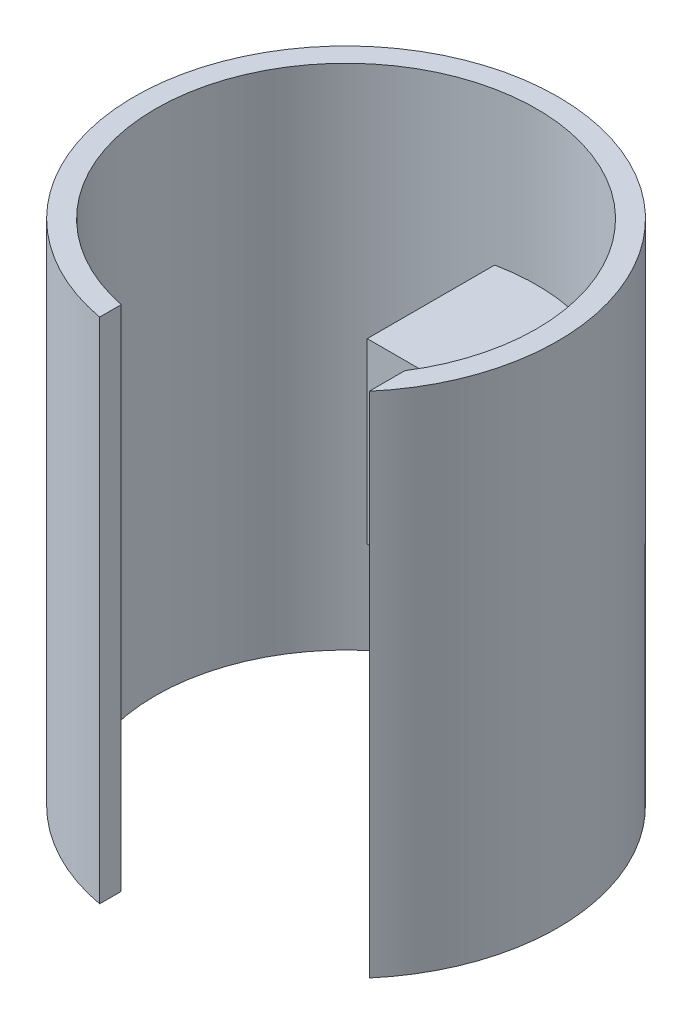
ISO-10303-21;
HEADER;
FILE_DESCRIPTION(('STEP AP214'),'2;1');
FILE_NAME('part.step','',(''),(''),'','','');
FILE_SCHEMA(('AUTOMOTIVE_DESIGN { 1 0 10303 214 1 1 1 1 }'));
ENDSEC;
DATA;
#1=APPLICATION_CONTEXT('core data for automotive mechanical design processes');
#2=APPLICATION_PROTOCOL_DEFINITION('international standard','automotive_design',2000,#1);
#3=PRODUCT_CONTEXT('',#1,'mechanical');
#4=PRODUCT('Part','Part','',(#3));
#5=PRODUCT_RELATED_PRODUCT_CATEGORY('part','',(#4));
#6=PRODUCT_DEFINITION_FORMATION('','',#4);
#7=PRODUCT_DEFINITION_CONTEXT('part definition',#1,'design');
#8=PRODUCT_DEFINITION('design','',#6,#7);
#9=PRODUCT_DEFINITION_SHAPE('','',#8);
#10=(LENGTH_UNIT() NAMED_UNIT(*) SI_UNIT(.MILLI.,.METRE.));
#11=(NAMED_UNIT(*) PLANE_ANGLE_UNIT() SI_UNIT($,.RADIAN.));
#12=(NAMED_UNIT(*) SI_UNIT($,.STERADIAN.) SOLID_ANGLE_UNIT());
#13=UNCERTAINTY_MEASURE_WITH_UNIT(LENGTH_MEASURE(1.E-05),#10,'distance_accuracy_value','');
#14=(GEOMETRIC_REPRESENTATION_CONTEXT(3) GLOBAL_UNCERTAINTY_ASSIGNED_CONTEXT((#13)) GLOBAL_UNIT_ASSIGNED_CONTEXT((#10,
#11,#12)) REPRESENTATION_CONTEXT('',''));
#15=CARTESIAN_POINT('',(0.,0.,0.));
#16=DIRECTION('',(0.,0.,1.));
#17=DIRECTION('',(1.,0.,0.));
#18=AXIS2_PLACEMENT_3D('',#15,#16,#17);
#19=CARTESIAN_POINT('',(0.,120.,0.));
#20=DIRECTION('',(0.,-1.,0.));
#21=DIRECTION('',(0.,0.,-1.));
#22=AXIS2_PLACEMENT_3D('',#19,#20,#21);
#23=CYLINDRICAL_SURFACE('',#22,50.);
#24=CARTESIAN_POINT('',(0.,120.,0.));
#25=DIRECTION('',(0.,1.,0.));
#26=DIRECTION('',(0.,0.,1.));
#27=AXIS2_PLACEMENT_3D('',#24,#25,#26);
#28=CIRCLE('',#27,50.);
#29=CARTESIAN_POINT('',(38.,120.,32.4961536185438));
#30=VERTEX_POINT('',#29);
#31=CARTESIAN_POINT('',(-9.,120.,49.1833305094317));
#32=VERTEX_POINT('',#31);
#33=EDGE_CURVE('E11',#30,#32,#28,.T.);
#34=ORIENTED_EDGE('',*,*,#33,.F.);
#35=DIRECTION('',(0.,1.,0.));
#36=VECTOR('',#35,1.);
#37=CARTESIAN_POINT('',(38.,-0.001000000000001,32.4961536185438));
#38=LINE('',#37,#36);
#39=CARTESIAN_POINT('',(38.,0.,32.4961536185438));
#40=VERTEX_POINT('',#39);
#41=EDGE_CURVE('E150',#40,#30,#38,.T.);
#42=ORIENTED_EDGE('',*,*,#41,.F.);
#43=CARTESIAN_POINT('',(0.,0.,0.));
#44=DIRECTION('',(0.,1.,0.));
#45=DIRECTION('',(0.,0.,1.));
#46=AXIS2_PLACEMENT_3D('',#43,#44,#45);
#47=CIRCLE('',#46,50.);
#48=CARTESIAN_POINT('',(-9.,0.,49.1833305094317));
#49=VERTEX_POINT('',#48);
#50=EDGE_CURVE('E36',#40,#49,#47,.T.);
#51=ORIENTED_EDGE('',*,*,#50,.T.);
#52=DIRECTION('',(0.,1.,0.));
#53=VECTOR('',#52,1.);
#54=CARTESIAN_POINT('',(-9.,-0.001000000000001,49.1833305094317));
#55=LINE('',#54,#53);
#56=EDGE_CURVE('E103',#49,#32,#55,.T.);
#57=ORIENTED_EDGE('',*,*,#56,.T.);
#58=EDGE_LOOP('',(#34,#42,#51,#57));
#59=FACE_BOUND('',#58,.T.);
#60=ADVANCED_FACE('F33',(#59),#23,.T.);
#61=CARTESIAN_POINT('',(0.,120.,0.));
#62=DIRECTION('',(0.,1.,0.));
#63=DIRECTION('',(0.,0.,1.));
#64=AXIS2_PLACEMENT_3D('',#61,#62,#63);
#65=PLANE('',#64);
#66=DIRECTION('',(0.,0.,-1.));
#67=VECTOR('',#66,1.);
#68=CARTESIAN_POINT('',(38.,120.,24.1039415863879));
#69=LINE('',#68,#67);
#70=CARTESIAN_POINT('',(38.,120.,24.1039415863879));
#71=VERTEX_POINT('',#70);
#72=EDGE_CURVE('E55',#30,#71,#69,.T.);
#73=ORIENTED_EDGE('',*,*,#72,.F.);
#74=ORIENTED_EDGE('',*,*,#33,.T.);
#75=DIRECTION('',(0.,0.,1.));
#76=VECTOR('',#75,1.);
#77=CARTESIAN_POINT('',(-9.,120.,44.0908153700972));
#78=LINE('',#77,#76);
#79=CARTESIAN_POINT('',(-9.,120.,44.0908153700972));
#80=VERTEX_POINT('',#79);
#81=EDGE_CURVE('E97',#80,#32,#78,.T.);
#82=ORIENTED_EDGE('',*,*,#81,.F.);
#83=CARTESIAN_POINT('',(0.,120.,0.));
#84=DIRECTION('',(0.,1.,0.));
#85=DIRECTION('',(0.,0.,1.));
#86=AXIS2_PLACEMENT_3D('',#83,#84,#85);
#87=CIRCLE('',#86,45.);
#88=EDGE_CURVE('E108',#71,#80,#87,.T.);
#89=ORIENTED_EDGE('',*,*,#88,.F.);
#90=EDGE_LOOP('',(#73,#74,#82,#89));
#91=FACE_BOUND('',#90,.T.);
#92=ADVANCED_FACE('F107',(#91),#65,.T.);
#93=CARTESIAN_POINT('',(0.,0.,0.));
#94=DIRECTION('',(0.,1.,0.));
#95=DIRECTION('',(0.,0.,1.));
#96=AXIS2_PLACEMENT_3D('',#93,#94,#95);
#97=PLANE('',#96);
#98=ORIENTED_EDGE('',*,*,#50,.F.);
#99=DIRECTION('',(0.,0.,1.));
#100=VECTOR('',#99,1.);
#101=CARTESIAN_POINT('',(38.,0.,24.1039415863879));
#102=LINE('',#101,#100);
#103=CARTESIAN_POINT('',(38.,0.,24.1039415863879));
#104=VERTEX_POINT('',#103);
#105=EDGE_CURVE('E110',#104,#40,#102,.T.);
#106=ORIENTED_EDGE('',*,*,#105,.F.);
#107=CARTESIAN_POINT('',(0.,0.,0.));
#108=DIRECTION('',(0.,1.,0.));
#109=DIRECTION('',(0.,0.,1.));
#110=AXIS2_PLACEMENT_3D('',#107,#108,#109);
#111=CIRCLE('',#110,45.);
#112=CARTESIAN_POINT('',(-9.,0.,44.0908153700972));
#113=VERTEX_POINT('',#112);
#114=EDGE_CURVE('E114',#113,#104,#111,.F.);
#115=ORIENTED_EDGE('',*,*,#114,.F.);
#116=DIRECTION('',(0.,0.,-1.));
#117=VECTOR('',#116,1.);
#118=CARTESIAN_POINT('',(-9.,0.,44.0908153700972));
#119=LINE('',#118,#117);
#120=EDGE_CURVE('E47',#49,#113,#119,.T.);
#121=ORIENTED_EDGE('',*,*,#120,.F.);
#122=EDGE_LOOP('',(#98,#106,#115,#121));
#123=FACE_BOUND('',#122,.T.);
#124=ADVANCED_FACE('F161',(#123),#97,.F.);
#125=CARTESIAN_POINT('',(0.,-0.001000000000001,0.));
#126=DIRECTION('',(0.,1.,0.));
#127=DIRECTION('',(0.,0.,1.));
#128=AXIS2_PLACEMENT_3D('',#125,#126,#127);
#129=CYLINDRICAL_SURFACE('',#128,45.);
#130=DIRECTION('',(0.,1.,0.));
#131=VECTOR('',#130,1.);
#132=CARTESIAN_POINT('',(-8.99999999999997,-0.0010000000000062,-44.0908153700972));
#133=LINE('',#132,#131);
#134=CARTESIAN_POINT('',(-9.00000000000001,84.,-44.0908153700972));
#135=VERTEX_POINT('',#134);
#136=CARTESIAN_POINT('',(-8.99999999999997,42.,-44.0908153700972));
#137=VERTEX_POINT('',#136);
#138=EDGE_CURVE('E124',#135,#137,#133,.F.);
#139=ORIENTED_EDGE('',*,*,#138,.F.);
#140=CARTESIAN_POINT('',(0.,84.,0.));
#141=DIRECTION('',(0.,1.,0.));
#142=DIRECTION('',(0.,0.,1.));
#143=AXIS2_PLACEMENT_3D('',#140,#141,#142);
#144=CIRCLE('',#143,45.);
#145=CARTESIAN_POINT('',(38.,84.,-24.1039415863879));
#146=VERTEX_POINT('',#145);
#147=EDGE_CURVE('E121',#146,#135,#144,.T.);
#148=ORIENTED_EDGE('',*,*,#147,.F.);
#149=DIRECTION('',(0.,1.,0.));
#150=VECTOR('',#149,1.);
#151=CARTESIAN_POINT('',(38.,-0.000999999999988444,-24.1039415863879));
#152=LINE('',#151,#150);
#153=CARTESIAN_POINT('',(38.,42.,-24.1039415863879));
#154=VERTEX_POINT('',#153);
#155=EDGE_CURVE('E115',#154,#146,#152,.T.);
#156=ORIENTED_EDGE('',*,*,#155,.F.);
#157=CARTESIAN_POINT('',(0.,42.,0.));
#158=DIRECTION('',(0.,-1.,0.));
#159=DIRECTION('',(0.,0.,-1.));
#160=AXIS2_PLACEMENT_3D('',#157,#158,#159);
#161=CIRCLE('',#160,45.);
#162=EDGE_CURVE('E118',#137,#154,#161,.T.);
#163=ORIENTED_EDGE('',*,*,#162,.F.);
#164=EDGE_LOOP('',(#139,#148,#156,#163));
#165=FACE_BOUND('',#164,.T.);
#166=ORIENTED_EDGE('',*,*,#114,.T.);
#167=DIRECTION('',(0.,1.,0.));
#168=VECTOR('',#167,1.);
#169=CARTESIAN_POINT('',(38.,-0.001000000000001,24.1039415863879));
#170=LINE('',#169,#168);
#171=EDGE_CURVE('E113',#104,#71,#170,.T.);
#172=ORIENTED_EDGE('',*,*,#171,.T.);
#173=ORIENTED_EDGE('',*,*,#88,.T.);
#174=DIRECTION('',(0.,1.,0.));
#175=VECTOR('',#174,1.);
#176=CARTESIAN_POINT('',(-9.,-0.001000000000001,44.0908153700972));
#177=LINE('',#176,#175);
#178=EDGE_CURVE('E94',#113,#80,#177,.T.);
#179=ORIENTED_EDGE('',*,*,#178,.F.);
#180=EDGE_LOOP('',(#166,#172,#173,#179));
#181=FACE_BOUND('',#180,.T.);
#182=ADVANCED_FACE('F112',(#165,#181),#129,.F.);
#183=CARTESIAN_POINT('',(-9.00000000000001,84.,-50.001));
#184=DIRECTION('',(0.,1.,0.));
#185=DIRECTION('',(0.,0.,1.));
#186=AXIS2_PLACEMENT_3D('',#183,#184,#185);
#187=PLANE('',#186);
#188=DIRECTION('',(-1.,0.,0.));
#189=VECTOR('',#188,1.);
#190=CARTESIAN_POINT('',(-9.00000000000001,84.,-14.));
#191=LINE('',#190,#189);
#192=CARTESIAN_POINT('',(38.,84.,-14.));
#193=VERTEX_POINT('',#192);
#194=CARTESIAN_POINT('',(-9.00000000000001,84.,-14.));
#195=VERTEX_POINT('',#194);
#196=EDGE_CURVE('E144',#193,#195,#191,.T.);
#197=ORIENTED_EDGE('',*,*,#196,.F.);
#198=DIRECTION('',(0.,0.,1.));
#199=VECTOR('',#198,1.);
#200=CARTESIAN_POINT('',(38.,84.,-50.001));
#201=LINE('',#200,#199);
#202=EDGE_CURVE('E126',#146,#193,#201,.T.);
#203=ORIENTED_EDGE('',*,*,#202,.F.);
#204=ORIENTED_EDGE('',*,*,#147,.T.);
#205=DIRECTION('',(0.,0.,1.));
#206=VECTOR('',#205,1.);
#207=CARTESIAN_POINT('',(-9.00000000000001,84.,-50.001));
#208=LINE('',#207,#206);
#209=EDGE_CURVE('E129',#135,#195,#208,.T.);
#210=ORIENTED_EDGE('',*,*,#209,.T.);
#211=EDGE_LOOP('',(#197,#203,#204,#210));
#212=FACE_BOUND('',#211,.T.);
#213=ADVANCED_FACE('F167',(#212),#187,.T.);
#214=CARTESIAN_POINT('',(-8.99999999999999,42.,-50.001));
#215=DIRECTION('',(-1.,0.,0.));
#216=DIRECTION('',(0.,-1.,0.));
#217=AXIS2_PLACEMENT_3D('',#214,#215,#216);
#218=PLANE('',#217);
#219=DIRECTION('',(0.,-1.,0.));
#220=VECTOR('',#219,1.);
#221=CARTESIAN_POINT('',(-9.,42.,-14.));
#222=LINE('',#221,#220);
#223=CARTESIAN_POINT('',(-9.,42.,-14.));
#224=VERTEX_POINT('',#223);
#225=EDGE_CURVE('E142',#195,#224,#222,.T.);
#226=ORIENTED_EDGE('',*,*,#225,.F.);
#227=ORIENTED_EDGE('',*,*,#209,.F.);
#228=ORIENTED_EDGE('',*,*,#138,.T.);
#229=DIRECTION('',(0.,0.,1.));
#230=VECTOR('',#229,1.);
#231=CARTESIAN_POINT('',(-8.99999999999999,42.,-50.001));
#232=LINE('',#231,#230);
#233=EDGE_CURVE('E133',#137,#224,#232,.T.);
#234=ORIENTED_EDGE('',*,*,#233,.T.);
#235=EDGE_LOOP('',(#226,#227,#228,#234));
#236=FACE_BOUND('',#235,.T.);
#237=ADVANCED_FACE('F221',(#236),#218,.T.);
#238=CARTESIAN_POINT('',(-8.99999999999999,42.,-50.001));
#239=DIRECTION('',(0.,-1.,0.));
#240=DIRECTION('',(0.,0.,-1.));
#241=AXIS2_PLACEMENT_3D('',#238,#239,#240);
#242=PLANE('',#241);
#243=DIRECTION('',(1.,0.,0.));
#244=VECTOR('',#243,1.);
#245=CARTESIAN_POINT('',(-9.,42.,-14.));
#246=LINE('',#245,#244);
#247=CARTESIAN_POINT('',(38.,42.,-14.));
#248=VERTEX_POINT('',#247);
#249=EDGE_CURVE('E130',#224,#248,#246,.T.);
#250=ORIENTED_EDGE('',*,*,#249,.F.);
#251=ORIENTED_EDGE('',*,*,#233,.F.);
#252=ORIENTED_EDGE('',*,*,#162,.T.);
#253=DIRECTION('',(0.,0.,1.));
#254=VECTOR('',#253,1.);
#255=CARTESIAN_POINT('',(38.,42.,-50.001));
#256=LINE('',#255,#254);
#257=EDGE_CURVE('E125',#154,#248,#256,.T.);
#258=ORIENTED_EDGE('',*,*,#257,.T.);
#259=EDGE_LOOP('',(#250,#251,#252,#258));
#260=FACE_BOUND('',#259,.T.);
#261=ADVANCED_FACE('F218',(#260),#242,.T.);
#262=CARTESIAN_POINT('',(38.,42.,-50.001));
#263=DIRECTION('',(1.,0.,0.));
#264=DIRECTION('',(0.,1.,0.));
#265=AXIS2_PLACEMENT_3D('',#262,#263,#264);
#266=PLANE('',#265);
#267=DIRECTION('',(0.,1.,0.));
#268=VECTOR('',#267,1.);
#269=CARTESIAN_POINT('',(38.,42.,-14.));
#270=LINE('',#269,#268);
#271=EDGE_CURVE('E146',#248,#193,#270,.T.);
#272=ORIENTED_EDGE('',*,*,#271,.F.);
#273=ORIENTED_EDGE('',*,*,#257,.F.);
#274=ORIENTED_EDGE('',*,*,#155,.T.);
#275=ORIENTED_EDGE('',*,*,#202,.T.);
#276=EDGE_LOOP('',(#272,#273,#274,#275));
#277=FACE_BOUND('',#276,.T.);
#278=ADVANCED_FACE('F216',(#277),#266,.T.);
#279=CARTESIAN_POINT('',(0.,0.,-14.));
#280=DIRECTION('',(0.,0.,-1.));
#281=DIRECTION('',(-1.,0.,0.));
#282=AXIS2_PLACEMENT_3D('',#279,#280,#281);
#283=PLANE('',#282);
#284=ORIENTED_EDGE('',*,*,#271,.T.);
#285=ORIENTED_EDGE('',*,*,#196,.T.);
#286=ORIENTED_EDGE('',*,*,#225,.T.);
#287=ORIENTED_EDGE('',*,*,#249,.T.);
#288=EDGE_LOOP('',(#284,#285,#286,#287));
#289=FACE_BOUND('',#288,.T.);
#290=ADVANCED_FACE('F200',(#289),#283,.F.);
#291=CARTESIAN_POINT('',(-9.,-0.001000000000001,44.0908153700972));
#292=DIRECTION('',(-1.,0.,0.));
#293=DIRECTION('',(0.,0.,1.));
#294=AXIS2_PLACEMENT_3D('',#291,#292,#293);
#295=PLANE('',#294);
#296=ORIENTED_EDGE('',*,*,#120,.T.);
#297=ORIENTED_EDGE('',*,*,#178,.T.);
#298=ORIENTED_EDGE('',*,*,#81,.T.);
#299=ORIENTED_EDGE('',*,*,#56,.F.);
#300=EDGE_LOOP('',(#296,#297,#298,#299));
#301=FACE_BOUND('',#300,.T.);
#302=ADVANCED_FACE('F96',(#301),#295,.F.);
#303=CARTESIAN_POINT('',(38.,-0.001000000000001,24.1039415863879));
#304=DIRECTION('',(1.,0.,0.));
#305=DIRECTION('',(0.,0.,-1.));
#306=AXIS2_PLACEMENT_3D('',#303,#304,#305);
#307=PLANE('',#306);
#308=ORIENTED_EDGE('',*,*,#105,.T.);
#309=ORIENTED_EDGE('',*,*,#41,.T.);
#310=ORIENTED_EDGE('',*,*,#72,.T.);
#311=ORIENTED_EDGE('',*,*,#171,.F.);
#312=EDGE_LOOP('',(#308,#309,#310,#311));
#313=FACE_BOUND('',#312,.T.);
#314=ADVANCED_FACE('F156',(#313),#307,.F.);
#315=CLOSED_SHELL('',(#60,#92,#124,#182,#213,#237,#261,#278,#290,#302,#314));
#316=MANIFOLD_SOLID_BREP('B2',#315);
#317=ADVANCED_BREP_SHAPE_REPRESENTATION('',(#18,#316),#14);
#318=SHAPE_DEFINITION_REPRESENTATION(#9,#317);
ENDSEC;
END-ISO-10303-21;
